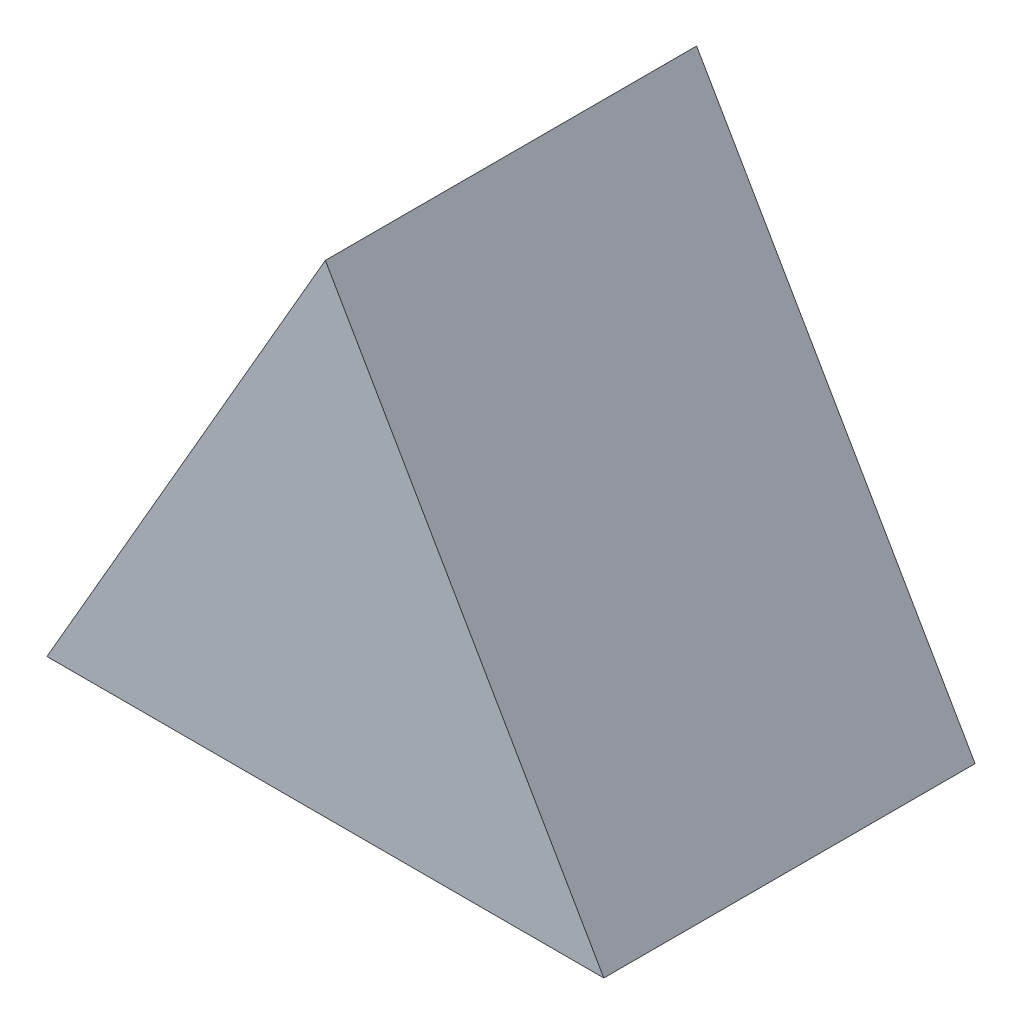
ISO-10303-21;
HEADER;
FILE_DESCRIPTION(('STEP AP214'),'2;1');
FILE_NAME('part.step','',(''),(''),'','','');
FILE_SCHEMA(('AUTOMOTIVE_DESIGN { 1 0 10303 214 1 1 1 1 }'));
ENDSEC;
DATA;
#1=APPLICATION_CONTEXT('core data for automotive mechanical design processes');
#2=APPLICATION_PROTOCOL_DEFINITION('international standard','automotive_design',2000,#1);
#3=PRODUCT_CONTEXT('',#1,'mechanical');
#4=PRODUCT('Part','Part','',(#3));
#5=PRODUCT_RELATED_PRODUCT_CATEGORY('part','',(#4));
#6=PRODUCT_DEFINITION_FORMATION('','',#4);
#7=PRODUCT_DEFINITION_CONTEXT('part definition',#1,'design');
#8=PRODUCT_DEFINITION('design','',#6,#7);
#9=PRODUCT_DEFINITION_SHAPE('','',#8);
#10=(LENGTH_UNIT() NAMED_UNIT(*) SI_UNIT(.MILLI.,.METRE.));
#11=(NAMED_UNIT(*) PLANE_ANGLE_UNIT() SI_UNIT($,.RADIAN.));
#12=(NAMED_UNIT(*) SI_UNIT($,.STERADIAN.) SOLID_ANGLE_UNIT());
#13=UNCERTAINTY_MEASURE_WITH_UNIT(LENGTH_MEASURE(1.E-05),#10,'distance_accuracy_value','');
#14=(GEOMETRIC_REPRESENTATION_CONTEXT(3) GLOBAL_UNCERTAINTY_ASSIGNED_CONTEXT((#13)) GLOBAL_UNIT_ASSIGNED_CONTEXT((#10,
#11,#12)) REPRESENTATION_CONTEXT('',''));
#15=CARTESIAN_POINT('',(0.,0.,0.));
#16=DIRECTION('',(0.,0.,1.));
#17=DIRECTION('',(1.,0.,0.));
#18=AXIS2_PLACEMENT_3D('',#15,#16,#17);
#19=CARTESIAN_POINT('',(30.,-17.3205080756888,40.));
#20=DIRECTION('',(-0.866025403784438,-0.5,0.));
#21=DIRECTION('',(0.5,-0.866025403784438,0.));
#22=AXIS2_PLACEMENT_3D('',#19,#20,#21);
#23=PLANE('',#22);
#24=DIRECTION('',(-0.5,0.866025403784438,0.));
#25=VECTOR('',#24,1.);
#26=CARTESIAN_POINT('',(30.,-17.3205080756888,0.));
#27=LINE('',#26,#25);
#28=CARTESIAN_POINT('',(30.,-17.3205080756888,0.));
#29=VERTEX_POINT('',#28);
#30=CARTESIAN_POINT('',(0.,34.6410161513775,0.));
#31=VERTEX_POINT('',#30);
#32=EDGE_CURVE('E82',#29,#31,#27,.T.);
#33=ORIENTED_EDGE('',*,*,#32,.T.);
#34=DIRECTION('',(0.,0.,-1.));
#35=VECTOR('',#34,1.);
#36=CARTESIAN_POINT('',(0.,34.6410161513775,40.));
#37=LINE('',#36,#35);
#38=CARTESIAN_POINT('',(0.,34.6410161513775,40.));
#39=VERTEX_POINT('',#38);
#40=EDGE_CURVE('E11',#39,#31,#37,.T.);
#41=ORIENTED_EDGE('',*,*,#40,.F.);
#42=DIRECTION('',(-0.5,0.866025403784438,0.));
#43=VECTOR('',#42,1.);
#44=CARTESIAN_POINT('',(30.,-17.3205080756888,40.));
#45=LINE('',#44,#43);
#46=CARTESIAN_POINT('',(30.,-17.3205080756888,40.));
#47=VERTEX_POINT('',#46);
#48=EDGE_CURVE('E75',#47,#39,#45,.T.);
#49=ORIENTED_EDGE('',*,*,#48,.F.);
#50=DIRECTION('',(0.,0.,-1.));
#51=VECTOR('',#50,1.);
#52=CARTESIAN_POINT('',(30.,-17.3205080756888,40.));
#53=LINE('',#52,#51);
#54=EDGE_CURVE('E83',#47,#29,#53,.T.);
#55=ORIENTED_EDGE('',*,*,#54,.T.);
#56=EDGE_LOOP('',(#33,#41,#49,#55));
#57=FACE_BOUND('',#56,.T.);
#58=ADVANCED_FACE('F35',(#57),#23,.F.);
#59=CARTESIAN_POINT('',(0.,34.6410161513775,40.));
#60=DIRECTION('',(0.866025403784439,-0.5,0.));
#61=DIRECTION('',(0.5,0.866025403784439,0.));
#62=AXIS2_PLACEMENT_3D('',#59,#60,#61);
#63=PLANE('',#62);
#64=DIRECTION('',(-0.5,-0.866025403784439,0.));
#65=VECTOR('',#64,1.);
#66=CARTESIAN_POINT('',(0.,34.6410161513775,0.));
#67=LINE('',#66,#65);
#68=CARTESIAN_POINT('',(-30.,-17.3205080756888,0.));
#69=VERTEX_POINT('',#68);
#70=EDGE_CURVE('E63',#31,#69,#67,.T.);
#71=ORIENTED_EDGE('',*,*,#70,.T.);
#72=DIRECTION('',(0.,0.,-1.));
#73=VECTOR('',#72,1.);
#74=CARTESIAN_POINT('',(-30.,-17.3205080756888,40.));
#75=LINE('',#74,#73);
#76=CARTESIAN_POINT('',(-30.,-17.3205080756888,40.));
#77=VERTEX_POINT('',#76);
#78=EDGE_CURVE('E43',#77,#69,#75,.T.);
#79=ORIENTED_EDGE('',*,*,#78,.F.);
#80=DIRECTION('',(-0.5,-0.866025403784439,0.));
#81=VECTOR('',#80,1.);
#82=CARTESIAN_POINT('',(0.,34.6410161513775,40.));
#83=LINE('',#82,#81);
#84=EDGE_CURVE('E71',#39,#77,#83,.T.);
#85=ORIENTED_EDGE('',*,*,#84,.F.);
#86=ORIENTED_EDGE('',*,*,#40,.T.);
#87=EDGE_LOOP('',(#71,#79,#85,#86));
#88=FACE_BOUND('',#87,.T.);
#89=ADVANCED_FACE('F72',(#88),#63,.F.);
#90=CARTESIAN_POINT('',(-30.,-17.3205080756888,40.));
#91=DIRECTION('',(0.,1.,0.));
#92=DIRECTION('',(0.,0.,1.));
#93=AXIS2_PLACEMENT_3D('',#90,#91,#92);
#94=PLANE('',#93);
#95=DIRECTION('',(1.,0.,0.));
#96=VECTOR('',#95,1.);
#97=CARTESIAN_POINT('',(-30.,-17.3205080756888,0.));
#98=LINE('',#97,#96);
#99=EDGE_CURVE('E68',#69,#29,#98,.T.);
#100=ORIENTED_EDGE('',*,*,#99,.T.);
#101=ORIENTED_EDGE('',*,*,#54,.F.);
#102=DIRECTION('',(1.,0.,0.));
#103=VECTOR('',#102,1.);
#104=CARTESIAN_POINT('',(-30.,-17.3205080756888,40.));
#105=LINE('',#104,#103);
#106=EDGE_CURVE('E51',#77,#47,#105,.T.);
#107=ORIENTED_EDGE('',*,*,#106,.F.);
#108=ORIENTED_EDGE('',*,*,#78,.T.);
#109=EDGE_LOOP('',(#100,#101,#107,#108));
#110=FACE_BOUND('',#109,.T.);
#111=ADVANCED_FACE('F90',(#110),#94,.F.);
#112=CARTESIAN_POINT('',(0.,0.,40.));
#113=DIRECTION('',(0.,0.,1.));
#114=DIRECTION('',(1.,0.,0.));
#115=AXIS2_PLACEMENT_3D('',#112,#113,#114);
#116=PLANE('',#115);
#117=ORIENTED_EDGE('',*,*,#48,.T.);
#118=ORIENTED_EDGE('',*,*,#84,.T.);
#119=ORIENTED_EDGE('',*,*,#106,.T.);
#120=EDGE_LOOP('',(#117,#118,#119));
#121=FACE_BOUND('',#120,.T.);
#122=ADVANCED_FACE('F78',(#121),#116,.T.);
#123=CARTESIAN_POINT('',(0.,0.,0.));
#124=DIRECTION('',(0.,0.,1.));
#125=DIRECTION('',(1.,0.,0.));
#126=AXIS2_PLACEMENT_3D('',#123,#124,#125);
#127=PLANE('',#126);
#128=ORIENTED_EDGE('',*,*,#32,.F.);
#129=ORIENTED_EDGE('',*,*,#99,.F.);
#130=ORIENTED_EDGE('',*,*,#70,.F.);
#131=EDGE_LOOP('',(#128,#129,#130));
#132=FACE_BOUND('',#131,.T.);
#133=ADVANCED_FACE('F91',(#132),#127,.F.);
#134=CLOSED_SHELL('',(#58,#89,#111,#122,#133));
#135=MANIFOLD_SOLID_BREP('B2',#134);
#136=ADVANCED_BREP_SHAPE_REPRESENTATION('',(#18,#135),#14);
#137=SHAPE_DEFINITION_REPRESENTATION(#9,#136);
ENDSEC;
END-ISO-10303-21;
